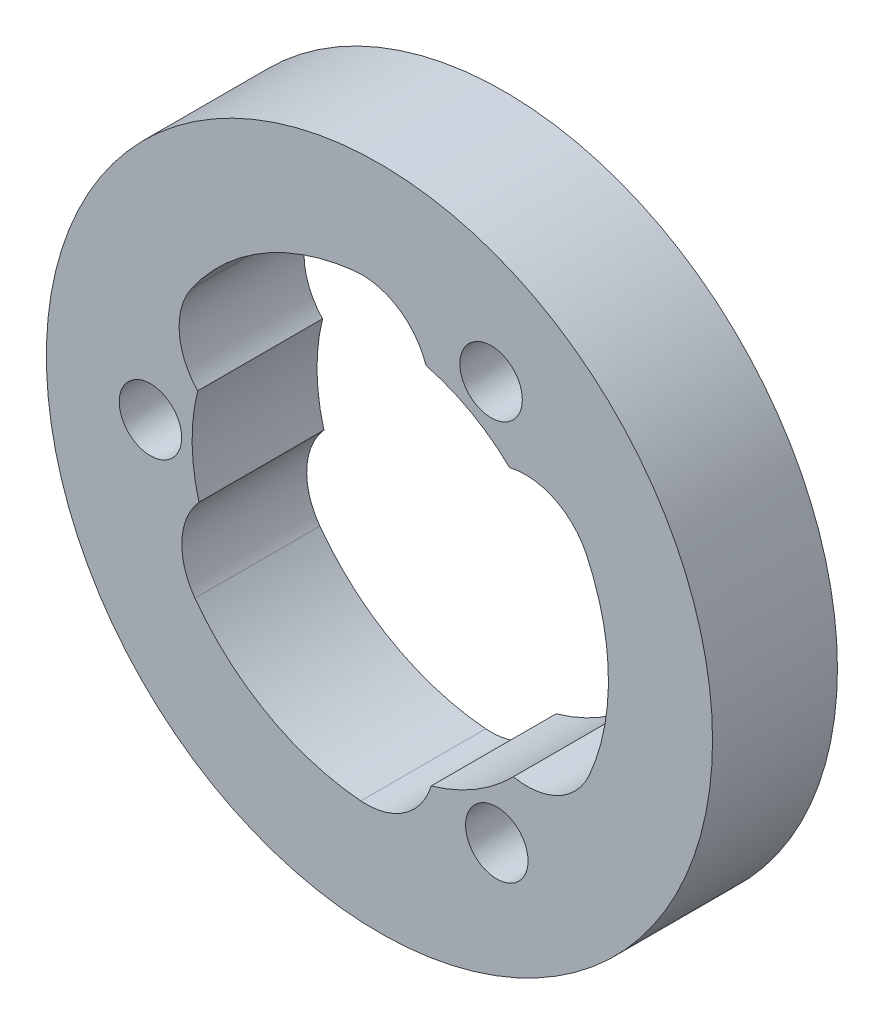
ISO-10303-21;
HEADER;
FILE_DESCRIPTION(('STEP AP214'),'2;1');
FILE_NAME('part.step','',(''),(''),'','','');
FILE_SCHEMA(('AUTOMOTIVE_DESIGN { 1 0 10303 214 1 1 1 1 }'));
ENDSEC;
DATA;
#1=APPLICATION_CONTEXT('core data for automotive mechanical design processes');
#2=APPLICATION_PROTOCOL_DEFINITION('international standard','automotive_design',2000,#1);
#3=PRODUCT_CONTEXT('',#1,'mechanical');
#4=PRODUCT('Part','Part','',(#3));
#5=PRODUCT_RELATED_PRODUCT_CATEGORY('part','',(#4));
#6=PRODUCT_DEFINITION_FORMATION('','',#4);
#7=PRODUCT_DEFINITION_CONTEXT('part definition',#1,'design');
#8=PRODUCT_DEFINITION('design','',#6,#7);
#9=PRODUCT_DEFINITION_SHAPE('','',#8);
#10=(LENGTH_UNIT() NAMED_UNIT(*) SI_UNIT(.MILLI.,.METRE.));
#11=(NAMED_UNIT(*) PLANE_ANGLE_UNIT() SI_UNIT($,.RADIAN.));
#12=(NAMED_UNIT(*) SI_UNIT($,.STERADIAN.) SOLID_ANGLE_UNIT());
#13=UNCERTAINTY_MEASURE_WITH_UNIT(LENGTH_MEASURE(1.E-05),#10,'distance_accuracy_value','');
#14=(GEOMETRIC_REPRESENTATION_CONTEXT(3) GLOBAL_UNCERTAINTY_ASSIGNED_CONTEXT((#13)) GLOBAL_UNIT_ASSIGNED_CONTEXT((#10,
#11,#12)) REPRESENTATION_CONTEXT('',''));
#15=CARTESIAN_POINT('',(0.,0.,0.));
#16=DIRECTION('',(0.,0.,1.));
#17=DIRECTION('',(1.,0.,0.));
#18=AXIS2_PLACEMENT_3D('',#15,#16,#17);
#19=CARTESIAN_POINT('',(0.,0.,6.));
#20=DIRECTION('',(0.,0.,1.));
#21=DIRECTION('',(1.,0.,0.));
#22=AXIS2_PLACEMENT_3D('',#19,#20,#21);
#23=PLANE('',#22);
#24=CARTESIAN_POINT('',(5.36232428206179,9.60445096265309,6.));
#25=DIRECTION('',(0.,0.,1.));
#26=DIRECTION('',(1.,0.,0.));
#27=AXIS2_PLACEMENT_3D('',#24,#25,#26);
#28=CIRCLE('',#27,1.50000000000234);
#29=CARTESIAN_POINT('',(6.86232428206413,9.60445096265309,6.));
#30=VERTEX_POINT('',#29);
#31=EDGE_CURVE('E167',#30,#30,#28,.T.);
#32=ORIENTED_EDGE('',*,*,#31,.F.);
#33=EDGE_LOOP('',(#32));
#34=FACE_BOUND('',#33,.T.);
#35=CARTESIAN_POINT('',(0.,0.,6.));
#36=DIRECTION('',(0.,0.,1.));
#37=DIRECTION('',(1.,0.,0.));
#38=AXIS2_PLACEMENT_3D('',#35,#36,#37);
#39=CIRCLE('',#38,16.);
#40=CARTESIAN_POINT('',(16.,0.,6.));
#41=VERTEX_POINT('',#40);
#42=EDGE_CURVE('E11',#41,#41,#39,.T.);
#43=ORIENTED_EDGE('',*,*,#42,.T.);
#44=EDGE_LOOP('',(#43));
#45=FACE_BOUND('',#44,.T.);
#46=CARTESIAN_POINT('',(-10.9988606640904,-0.158316429730885,6.));
#47=DIRECTION('',(0.,0.,1.));
#48=DIRECTION('',(1.,0.,0.));
#49=AXIS2_PLACEMENT_3D('',#46,#47,#48);
#50=CIRCLE('',#49,1.50000000000233);
#51=CARTESIAN_POINT('',(-9.49886066408805,-0.158316429730885,6.));
#52=VERTEX_POINT('',#51);
#53=EDGE_CURVE('E217',#52,#52,#50,.T.);
#54=ORIENTED_EDGE('',*,*,#53,.F.);
#55=EDGE_LOOP('',(#54));
#56=FACE_BOUND('',#55,.T.);
#57=CARTESIAN_POINT('',(7.0975423071489,-3.11245774240257,6.));
#58=DIRECTION('',(0.,0.,1.));
#59=DIRECTION('',(1.,0.,0.));
#60=AXIS2_PLACEMENT_3D('',#57,#58,#59);
#61=CIRCLE('',#60,3.24999999999912);
#62=CARTESIAN_POINT('',(6.43330341520316,-6.29385471455504,6.));
#63=VERTEX_POINT('',#62);
#64=CARTESIAN_POINT('',(10.0739310165974,-4.41768195695802,6.));
#65=VERTEX_POINT('',#64);
#66=EDGE_CURVE('E129',#63,#65,#61,.T.);
#67=ORIENTED_EDGE('',*,*,#66,.F.);
#68=CARTESIAN_POINT('',(0.,0.,6.));
#69=DIRECTION('',(0.,0.,1.));
#70=DIRECTION('',(1.,0.,0.));
#71=AXIS2_PLACEMENT_3D('',#68,#69,#70);
#72=CIRCLE('',#71,9.);
#73=CARTESIAN_POINT('',(2.48399034547778,-8.65042149051563,6.));
#74=VERTEX_POINT('',#73);
#75=EDGE_CURVE('E121',#74,#63,#72,.T.);
#76=ORIENTED_EDGE('',*,*,#75,.F.);
#77=CARTESIAN_POINT('',(-0.6312472118548,-7.72424928116174,6.));
#78=DIRECTION('',(0.,0.,1.));
#79=DIRECTION('',(1.,0.,0.));
#80=AXIS2_PLACEMENT_3D('',#77,#78,#79);
#81=CIRCLE('',#80,3.24999999999922);
#82=CARTESIAN_POINT('',(-0.895963784568041,-10.9634505926158,6.));
#83=VERTEX_POINT('',#82);
#84=EDGE_CURVE('E164',#83,#74,#81,.T.);
#85=ORIENTED_EDGE('',*,*,#84,.F.);
#86=CARTESIAN_POINT('',(0.,0.,6.));
#87=DIRECTION('',(0.,0.,1.));
#88=DIRECTION('',(1.,0.,0.));
#89=AXIS2_PLACEMENT_3D('',#86,#87,#88);
#90=CIRCLE('',#89,10.9999999999992);
#91=CARTESIAN_POINT('',(-8.86279030886448,-6.51543919786632,6.));
#92=VERTEX_POINT('',#91);
#93=EDGE_CURVE('E162',#92,#83,#90,.T.);
#94=ORIENTED_EDGE('',*,*,#93,.F.);
#95=CARTESIAN_POINT('',(-6.24423862670063,-4.59042307122448,6.));
#96=DIRECTION('',(0.,0.,1.));
#97=DIRECTION('',(1.,0.,0.));
#98=AXIS2_PLACEMENT_3D('',#95,#96,#97);
#99=CIRCLE('',#98,3.24999999999912);
#100=CARTESIAN_POINT('',(-8.66728977813536,-2.42447683054102,6.));
#101=VERTEX_POINT('',#100);
#102=EDGE_CURVE('E160',#101,#92,#99,.T.);
#103=ORIENTED_EDGE('',*,*,#102,.F.);
#104=CARTESIAN_POINT('',(0.,0.,6.));
#105=DIRECTION('',(0.,0.,1.));
#106=DIRECTION('',(1.,0.,0.));
#107=AXIS2_PLACEMENT_3D('',#104,#105,#106);
#108=CIRCLE('',#107,9.);
#109=CARTESIAN_POINT('',(-8.73347993696803,2.17401200331875,6.));
#110=VERTEX_POINT('',#109);
#111=EDGE_CURVE('E158',#110,#101,#108,.T.);
#112=ORIENTED_EDGE('',*,*,#111,.F.);
#113=CARTESIAN_POINT('',(-6.37377249672235,4.40880076211522,6.));
#114=DIRECTION('',(0.,0.,1.));
#115=DIRECTION('',(1.,0.,0.));
#116=AXIS2_PLACEMENT_3D('',#113,#114,#115);
#117=CIRCLE('',#116,3.24999999999906);
#118=CARTESIAN_POINT('',(-9.04664483405625,6.25765269461415,6.));
#119=VERTEX_POINT('',#118);
#120=EDGE_CURVE('E156',#119,#110,#117,.T.);
#121=ORIENTED_EDGE('',*,*,#120,.F.);
#122=CARTESIAN_POINT('',(0.,0.,6.));
#123=DIRECTION('',(0.,0.,1.));
#124=DIRECTION('',(1.,0.,0.));
#125=AXIS2_PLACEMENT_3D('',#122,#123,#124);
#126=CIRCLE('',#125,10.9999999999986);
#127=CARTESIAN_POINT('',(-1.21114070773317,10.933121154824,6.));
#128=VERTEX_POINT('',#127);
#129=EDGE_CURVE('E154',#128,#119,#126,.T.);
#130=ORIENTED_EDGE('',*,*,#129,.F.);
#131=CARTESIAN_POINT('',(-0.853303680448273,7.70288081362704,6.));
#132=DIRECTION('',(0.,0.,1.));
#133=DIRECTION('',(1.,0.,0.));
#134=AXIS2_PLACEMENT_3D('',#131,#132,#133);
#135=CIRCLE('',#134,3.2499999999988);
#136=CARTESIAN_POINT('',(2.23398636293237,8.71833154509693,6.));
#137=VERTEX_POINT('',#136);
#138=EDGE_CURVE('E152',#137,#128,#135,.T.);
#139=ORIENTED_EDGE('',*,*,#138,.F.);
#140=CARTESIAN_POINT('',(0.,0.,6.));
#141=DIRECTION('',(0.,0.,1.));
#142=DIRECTION('',(1.,0.,0.));
#143=AXIS2_PLACEMENT_3D('',#140,#141,#142);
#144=CIRCLE('',#143,9.);
#145=CARTESIAN_POINT('',(6.24948959149049,6.47640948719686,6.));
#146=VERTEX_POINT('',#145);
#147=EDGE_CURVE('E150',#146,#137,#144,.T.);
#148=ORIENTED_EDGE('',*,*,#147,.F.);
#149=CARTESIAN_POINT('',(7.00501970857715,3.31544851904651,6.));
#150=DIRECTION('',(0.,0.,1.));
#151=DIRECTION('',(1.,0.,0.));
#152=AXIS2_PLACEMENT_3D('',#149,#150,#151);
#153=CIRCLE('',#152,3.24999999999922);
#154=CARTESIAN_POINT('',(9.94260861862474,4.70579789800108,6.));
#155=VERTEX_POINT('',#154);
#156=EDGE_CURVE('E145',#155,#146,#153,.T.);
#157=ORIENTED_EDGE('',*,*,#156,.F.);
#158=CARTESIAN_POINT('',(0.,0.,6.));
#159=DIRECTION('',(0.,0.,1.));
#160=DIRECTION('',(1.,0.,0.));
#161=AXIS2_PLACEMENT_3D('',#158,#159,#160);
#162=CIRCLE('',#161,10.9999999999992);
#163=EDGE_CURVE('E143',#65,#155,#162,.T.);
#164=ORIENTED_EDGE('',*,*,#163,.F.);
#165=EDGE_LOOP('',(#67,#76,#85,#94,#103,#112,#121,#130,#139,#148,#157,#164));
#166=FACE_BOUND('',#165,.T.);
#167=CARTESIAN_POINT('',(5.6365363820286,-9.44613453292221,6.));
#168=DIRECTION('',(0.,0.,1.));
#169=DIRECTION('',(1.,0.,0.));
#170=AXIS2_PLACEMENT_3D('',#167,#168,#169);
#171=CIRCLE('',#170,1.50000000000236);
#172=CARTESIAN_POINT('',(7.13653638203096,-9.44613453292221,6.));
#173=VERTEX_POINT('',#172);
#174=EDGE_CURVE('E261',#173,#173,#171,.T.);
#175=ORIENTED_EDGE('',*,*,#174,.F.);
#176=EDGE_LOOP('',(#175));
#177=FACE_BOUND('',#176,.T.);
#178=ADVANCED_FACE('F32',(#34,#45,#56,#166,#177),#23,.T.);
#179=CARTESIAN_POINT('',(0.,0.,0.));
#180=DIRECTION('',(0.,0.,1.));
#181=DIRECTION('',(1.,0.,0.));
#182=AXIS2_PLACEMENT_3D('',#179,#180,#181);
#183=PLANE('',#182);
#184=CARTESIAN_POINT('',(-10.9988606640904,-0.158316429730885,0.));
#185=DIRECTION('',(0.,0.,1.));
#186=DIRECTION('',(1.,0.,0.));
#187=AXIS2_PLACEMENT_3D('',#184,#185,#186);
#188=CIRCLE('',#187,1.50000000000233);
#189=CARTESIAN_POINT('',(-9.49886066408805,-0.158316429730885,0.));
#190=VERTEX_POINT('',#189);
#191=EDGE_CURVE('E137',#190,#190,#188,.T.);
#192=ORIENTED_EDGE('',*,*,#191,.T.);
#193=EDGE_LOOP('',(#192));
#194=FACE_BOUND('',#193,.T.);
#195=CARTESIAN_POINT('',(0.,0.,0.));
#196=DIRECTION('',(0.,0.,1.));
#197=DIRECTION('',(1.,0.,0.));
#198=AXIS2_PLACEMENT_3D('',#195,#196,#197);
#199=CIRCLE('',#198,16.);
#200=CARTESIAN_POINT('',(16.,0.,0.));
#201=VERTEX_POINT('',#200);
#202=EDGE_CURVE('E36',#201,#201,#199,.T.);
#203=ORIENTED_EDGE('',*,*,#202,.F.);
#204=EDGE_LOOP('',(#203));
#205=FACE_BOUND('',#204,.T.);
#206=CARTESIAN_POINT('',(0.,0.,0.));
#207=DIRECTION('',(0.,0.,1.));
#208=DIRECTION('',(1.,0.,0.));
#209=AXIS2_PLACEMENT_3D('',#206,#207,#208);
#210=CIRCLE('',#209,9.);
#211=CARTESIAN_POINT('',(2.48399034547778,-8.65042149051563,0.));
#212=VERTEX_POINT('',#211);
#213=CARTESIAN_POINT('',(6.43330341520316,-6.29385471455504,0.));
#214=VERTEX_POINT('',#213);
#215=EDGE_CURVE('E55',#212,#214,#210,.T.);
#216=ORIENTED_EDGE('',*,*,#215,.T.);
#217=CARTESIAN_POINT('',(7.0975423071489,-3.11245774240257,0.));
#218=DIRECTION('',(0.,0.,1.));
#219=DIRECTION('',(1.,0.,0.));
#220=AXIS2_PLACEMENT_3D('',#217,#218,#219);
#221=CIRCLE('',#220,3.24999999999912);
#222=CARTESIAN_POINT('',(10.0739310165974,-4.41768195695802,0.));
#223=VERTEX_POINT('',#222);
#224=EDGE_CURVE('E136',#214,#223,#221,.T.);
#225=ORIENTED_EDGE('',*,*,#224,.T.);
#226=CARTESIAN_POINT('',(0.,0.,0.));
#227=DIRECTION('',(0.,0.,1.));
#228=DIRECTION('',(1.,0.,0.));
#229=AXIS2_PLACEMENT_3D('',#226,#227,#228);
#230=CIRCLE('',#229,10.9999999999992);
#231=CARTESIAN_POINT('',(9.94260861862474,4.70579789800108,0.));
#232=VERTEX_POINT('',#231);
#233=EDGE_CURVE('E169',#223,#232,#230,.T.);
#234=ORIENTED_EDGE('',*,*,#233,.T.);
#235=CARTESIAN_POINT('',(7.00501970857715,3.31544851904651,0.));
#236=DIRECTION('',(0.,0.,1.));
#237=DIRECTION('',(1.,0.,0.));
#238=AXIS2_PLACEMENT_3D('',#235,#236,#237);
#239=CIRCLE('',#238,3.24999999999922);
#240=CARTESIAN_POINT('',(6.24948959149049,6.47640948719686,0.));
#241=VERTEX_POINT('',#240);
#242=EDGE_CURVE('E172',#232,#241,#239,.T.);
#243=ORIENTED_EDGE('',*,*,#242,.T.);
#244=CARTESIAN_POINT('',(0.,0.,0.));
#245=DIRECTION('',(0.,0.,1.));
#246=DIRECTION('',(1.,0.,0.));
#247=AXIS2_PLACEMENT_3D('',#244,#245,#246);
#248=CIRCLE('',#247,9.);
#249=CARTESIAN_POINT('',(2.23398636293237,8.71833154509693,0.));
#250=VERTEX_POINT('',#249);
#251=EDGE_CURVE('E175',#241,#250,#248,.T.);
#252=ORIENTED_EDGE('',*,*,#251,.T.);
#253=CARTESIAN_POINT('',(-0.853303680448273,7.70288081362704,0.));
#254=DIRECTION('',(0.,0.,1.));
#255=DIRECTION('',(1.,0.,0.));
#256=AXIS2_PLACEMENT_3D('',#253,#254,#255);
#257=CIRCLE('',#256,3.2499999999988);
#258=CARTESIAN_POINT('',(-1.21114070773317,10.933121154824,0.));
#259=VERTEX_POINT('',#258);
#260=EDGE_CURVE('E178',#250,#259,#257,.T.);
#261=ORIENTED_EDGE('',*,*,#260,.T.);
#262=CARTESIAN_POINT('',(0.,0.,0.));
#263=DIRECTION('',(0.,0.,1.));
#264=DIRECTION('',(1.,0.,0.));
#265=AXIS2_PLACEMENT_3D('',#262,#263,#264);
#266=CIRCLE('',#265,10.9999999999986);
#267=CARTESIAN_POINT('',(-9.04664483405625,6.25765269461415,0.));
#268=VERTEX_POINT('',#267);
#269=EDGE_CURVE('E181',#259,#268,#266,.T.);
#270=ORIENTED_EDGE('',*,*,#269,.T.);
#271=CARTESIAN_POINT('',(-6.37377249672235,4.40880076211522,0.));
#272=DIRECTION('',(0.,0.,1.));
#273=DIRECTION('',(1.,0.,0.));
#274=AXIS2_PLACEMENT_3D('',#271,#272,#273);
#275=CIRCLE('',#274,3.24999999999906);
#276=CARTESIAN_POINT('',(-8.73347993696803,2.17401200331875,0.));
#277=VERTEX_POINT('',#276);
#278=EDGE_CURVE('E184',#268,#277,#275,.T.);
#279=ORIENTED_EDGE('',*,*,#278,.T.);
#280=CARTESIAN_POINT('',(0.,0.,0.));
#281=DIRECTION('',(0.,0.,1.));
#282=DIRECTION('',(1.,0.,0.));
#283=AXIS2_PLACEMENT_3D('',#280,#281,#282);
#284=CIRCLE('',#283,9.);
#285=CARTESIAN_POINT('',(-8.66728977813536,-2.42447683054102,0.));
#286=VERTEX_POINT('',#285);
#287=EDGE_CURVE('E187',#277,#286,#284,.T.);
#288=ORIENTED_EDGE('',*,*,#287,.T.);
#289=CARTESIAN_POINT('',(-6.24423862670063,-4.59042307122448,0.));
#290=DIRECTION('',(0.,0.,1.));
#291=DIRECTION('',(1.,0.,0.));
#292=AXIS2_PLACEMENT_3D('',#289,#290,#291);
#293=CIRCLE('',#292,3.24999999999912);
#294=CARTESIAN_POINT('',(-8.86279030886448,-6.51543919786632,0.));
#295=VERTEX_POINT('',#294);
#296=EDGE_CURVE('E190',#286,#295,#293,.T.);
#297=ORIENTED_EDGE('',*,*,#296,.T.);
#298=CARTESIAN_POINT('',(0.,0.,0.));
#299=DIRECTION('',(0.,0.,1.));
#300=DIRECTION('',(1.,0.,0.));
#301=AXIS2_PLACEMENT_3D('',#298,#299,#300);
#302=CIRCLE('',#301,10.9999999999992);
#303=CARTESIAN_POINT('',(-0.895963784568028,-10.9634505926157,0.));
#304=VERTEX_POINT('',#303);
#305=EDGE_CURVE('E193',#295,#304,#302,.T.);
#306=ORIENTED_EDGE('',*,*,#305,.T.);
#307=CARTESIAN_POINT('',(-0.6312472118548,-7.72424928116174,0.));
#308=DIRECTION('',(0.,0.,1.));
#309=DIRECTION('',(1.,0.,0.));
#310=AXIS2_PLACEMENT_3D('',#307,#308,#309);
#311=CIRCLE('',#310,3.24999999999922);
#312=EDGE_CURVE('E130',#304,#212,#311,.T.);
#313=ORIENTED_EDGE('',*,*,#312,.T.);
#314=EDGE_LOOP('',(#216,#225,#234,#243,#252,#261,#270,#279,#288,#297,#306,#313));
#315=FACE_BOUND('',#314,.T.);
#316=CARTESIAN_POINT('',(5.36232428206179,9.60445096265309,0.));
#317=DIRECTION('',(0.,0.,1.));
#318=DIRECTION('',(1.,0.,0.));
#319=AXIS2_PLACEMENT_3D('',#316,#317,#318);
#320=CIRCLE('',#319,1.50000000000234);
#321=CARTESIAN_POINT('',(6.86232428206413,9.60445096265309,0.));
#322=VERTEX_POINT('',#321);
#323=EDGE_CURVE('E256',#322,#322,#320,.T.);
#324=ORIENTED_EDGE('',*,*,#323,.T.);
#325=EDGE_LOOP('',(#324));
#326=FACE_BOUND('',#325,.T.);
#327=CARTESIAN_POINT('',(5.6365363820286,-9.44613453292221,0.));
#328=DIRECTION('',(0.,0.,1.));
#329=DIRECTION('',(1.,0.,0.));
#330=AXIS2_PLACEMENT_3D('',#327,#328,#329);
#331=CIRCLE('',#330,1.50000000000236);
#332=CARTESIAN_POINT('',(7.13653638203096,-9.44613453292221,0.));
#333=VERTEX_POINT('',#332);
#334=EDGE_CURVE('E259',#333,#333,#331,.T.);
#335=ORIENTED_EDGE('',*,*,#334,.T.);
#336=EDGE_LOOP('',(#335));
#337=FACE_BOUND('',#336,.T.);
#338=ADVANCED_FACE('F223',(#194,#205,#315,#326,#337),#183,.F.);
#339=CARTESIAN_POINT('',(0.,0.,6.));
#340=DIRECTION('',(0.,0.,-1.));
#341=DIRECTION('',(-1.,0.,0.));
#342=AXIS2_PLACEMENT_3D('',#339,#340,#341);
#343=CYLINDRICAL_SURFACE('',#342,16.);
#344=ORIENTED_EDGE('',*,*,#42,.F.);
#345=EDGE_LOOP('',(#344));
#346=FACE_BOUND('',#345,.T.);
#347=ORIENTED_EDGE('',*,*,#202,.T.);
#348=EDGE_LOOP('',(#347));
#349=FACE_BOUND('',#348,.T.);
#350=ADVANCED_FACE('F34',(#346,#349),#343,.T.);
#351=CARTESIAN_POINT('',(-10.9988606640904,-0.158316429730885,6.));
#352=DIRECTION('',(0.,0.,-1.));
#353=DIRECTION('',(-1.,0.,0.));
#354=AXIS2_PLACEMENT_3D('',#351,#352,#353);
#355=CYLINDRICAL_SURFACE('',#354,1.50000000000233);
#356=ORIENTED_EDGE('',*,*,#53,.T.);
#357=EDGE_LOOP('',(#356));
#358=FACE_BOUND('',#357,.T.);
#359=ORIENTED_EDGE('',*,*,#191,.F.);
#360=EDGE_LOOP('',(#359));
#361=FACE_BOUND('',#360,.T.);
#362=ADVANCED_FACE('F226',(#358,#361),#355,.F.);
#363=CARTESIAN_POINT('',(0.,0.,6.));
#364=DIRECTION('',(0.,0.,-1.));
#365=DIRECTION('',(-1.,0.,0.));
#366=AXIS2_PLACEMENT_3D('',#363,#364,#365);
#367=CYLINDRICAL_SURFACE('',#366,9.);
#368=ORIENTED_EDGE('',*,*,#215,.F.);
#369=DIRECTION('',(0.,0.,-1.));
#370=VECTOR('',#369,1.);
#371=CARTESIAN_POINT('',(2.48399034547778,-8.65042149051563,6.));
#372=LINE('',#371,#370);
#373=EDGE_CURVE('E125',#74,#212,#372,.T.);
#374=ORIENTED_EDGE('',*,*,#373,.F.);
#375=ORIENTED_EDGE('',*,*,#75,.T.);
#376=DIRECTION('',(0.,0.,-1.));
#377=VECTOR('',#376,1.);
#378=CARTESIAN_POINT('',(6.43330341520316,-6.29385471455504,6.));
#379=LINE('',#378,#377);
#380=EDGE_CURVE('E124',#63,#214,#379,.T.);
#381=ORIENTED_EDGE('',*,*,#380,.T.);
#382=EDGE_LOOP('',(#368,#374,#375,#381));
#383=FACE_BOUND('',#382,.T.);
#384=ADVANCED_FACE('F123',(#383),#367,.F.);
#385=CARTESIAN_POINT('',(7.0975423071489,-3.11245774240257,6.));
#386=DIRECTION('',(0.,0.,-1.));
#387=DIRECTION('',(-1.,0.,0.));
#388=AXIS2_PLACEMENT_3D('',#385,#386,#387);
#389=CYLINDRICAL_SURFACE('',#388,3.24999999999912);
#390=ORIENTED_EDGE('',*,*,#224,.F.);
#391=ORIENTED_EDGE('',*,*,#380,.F.);
#392=ORIENTED_EDGE('',*,*,#66,.T.);
#393=DIRECTION('',(0.,0.,-1.));
#394=VECTOR('',#393,1.);
#395=CARTESIAN_POINT('',(10.0739310165974,-4.41768195695802,6.));
#396=LINE('',#395,#394);
#397=EDGE_CURVE('E138',#65,#223,#396,.T.);
#398=ORIENTED_EDGE('',*,*,#397,.T.);
#399=EDGE_LOOP('',(#390,#391,#392,#398));
#400=FACE_BOUND('',#399,.T.);
#401=ADVANCED_FACE('F133',(#400),#389,.F.);
#402=CARTESIAN_POINT('',(0.,0.,6.));
#403=DIRECTION('',(0.,0.,-1.));
#404=DIRECTION('',(-1.,0.,0.));
#405=AXIS2_PLACEMENT_3D('',#402,#403,#404);
#406=CYLINDRICAL_SURFACE('',#405,10.9999999999992);
#407=ORIENTED_EDGE('',*,*,#233,.F.);
#408=ORIENTED_EDGE('',*,*,#397,.F.);
#409=ORIENTED_EDGE('',*,*,#163,.T.);
#410=DIRECTION('',(0.,0.,-1.));
#411=VECTOR('',#410,1.);
#412=CARTESIAN_POINT('',(9.94260861862474,4.70579789800108,6.));
#413=LINE('',#412,#411);
#414=EDGE_CURVE('E214',#155,#232,#413,.T.);
#415=ORIENTED_EDGE('',*,*,#414,.T.);
#416=EDGE_LOOP('',(#407,#408,#409,#415));
#417=FACE_BOUND('',#416,.T.);
#418=ADVANCED_FACE('F312',(#417),#406,.F.);
#419=CARTESIAN_POINT('',(7.00501970857715,3.31544851904651,6.));
#420=DIRECTION('',(0.,0.,-1.));
#421=DIRECTION('',(-1.,0.,0.));
#422=AXIS2_PLACEMENT_3D('',#419,#420,#421);
#423=CYLINDRICAL_SURFACE('',#422,3.24999999999922);
#424=ORIENTED_EDGE('',*,*,#242,.F.);
#425=ORIENTED_EDGE('',*,*,#414,.F.);
#426=ORIENTED_EDGE('',*,*,#156,.T.);
#427=DIRECTION('',(0.,0.,-1.));
#428=VECTOR('',#427,1.);
#429=CARTESIAN_POINT('',(6.24948959149049,6.47640948719686,6.));
#430=LINE('',#429,#428);
#431=EDGE_CURVE('E212',#146,#241,#430,.T.);
#432=ORIENTED_EDGE('',*,*,#431,.T.);
#433=EDGE_LOOP('',(#424,#425,#426,#432));
#434=FACE_BOUND('',#433,.T.);
#435=ADVANCED_FACE('F308',(#434),#423,.F.);
#436=CARTESIAN_POINT('',(0.,0.,6.));
#437=DIRECTION('',(0.,0.,-1.));
#438=DIRECTION('',(-1.,0.,0.));
#439=AXIS2_PLACEMENT_3D('',#436,#437,#438);
#440=CYLINDRICAL_SURFACE('',#439,9.);
#441=ORIENTED_EDGE('',*,*,#251,.F.);
#442=ORIENTED_EDGE('',*,*,#431,.F.);
#443=ORIENTED_EDGE('',*,*,#147,.T.);
#444=DIRECTION('',(0.,0.,-1.));
#445=VECTOR('',#444,1.);
#446=CARTESIAN_POINT('',(2.23398636293237,8.71833154509693,6.));
#447=LINE('',#446,#445);
#448=EDGE_CURVE('E210',#137,#250,#447,.T.);
#449=ORIENTED_EDGE('',*,*,#448,.T.);
#450=EDGE_LOOP('',(#441,#442,#443,#449));
#451=FACE_BOUND('',#450,.T.);
#452=ADVANCED_FACE('F304',(#451),#440,.F.);
#453=CARTESIAN_POINT('',(-0.853303680448273,7.70288081362704,6.));
#454=DIRECTION('',(0.,0.,-1.));
#455=DIRECTION('',(-1.,0.,0.));
#456=AXIS2_PLACEMENT_3D('',#453,#454,#455);
#457=CYLINDRICAL_SURFACE('',#456,3.2499999999988);
#458=ORIENTED_EDGE('',*,*,#260,.F.);
#459=ORIENTED_EDGE('',*,*,#448,.F.);
#460=ORIENTED_EDGE('',*,*,#138,.T.);
#461=DIRECTION('',(0.,0.,-1.));
#462=VECTOR('',#461,1.);
#463=CARTESIAN_POINT('',(-1.21114070773317,10.933121154824,6.));
#464=LINE('',#463,#462);
#465=EDGE_CURVE('E208',#128,#259,#464,.T.);
#466=ORIENTED_EDGE('',*,*,#465,.T.);
#467=EDGE_LOOP('',(#458,#459,#460,#466));
#468=FACE_BOUND('',#467,.T.);
#469=ADVANCED_FACE('F300',(#468),#457,.F.);
#470=CARTESIAN_POINT('',(0.,0.,6.));
#471=DIRECTION('',(0.,0.,-1.));
#472=DIRECTION('',(-1.,0.,0.));
#473=AXIS2_PLACEMENT_3D('',#470,#471,#472);
#474=CYLINDRICAL_SURFACE('',#473,10.9999999999986);
#475=ORIENTED_EDGE('',*,*,#269,.F.);
#476=ORIENTED_EDGE('',*,*,#465,.F.);
#477=ORIENTED_EDGE('',*,*,#129,.T.);
#478=DIRECTION('',(0.,0.,-1.));
#479=VECTOR('',#478,1.);
#480=CARTESIAN_POINT('',(-9.04664483405625,6.25765269461415,6.));
#481=LINE('',#480,#479);
#482=EDGE_CURVE('E206',#119,#268,#481,.T.);
#483=ORIENTED_EDGE('',*,*,#482,.T.);
#484=EDGE_LOOP('',(#475,#476,#477,#483));
#485=FACE_BOUND('',#484,.T.);
#486=ADVANCED_FACE('F296',(#485),#474,.F.);
#487=CARTESIAN_POINT('',(-6.37377249672235,4.40880076211522,6.));
#488=DIRECTION('',(0.,0.,-1.));
#489=DIRECTION('',(-1.,0.,0.));
#490=AXIS2_PLACEMENT_3D('',#487,#488,#489);
#491=CYLINDRICAL_SURFACE('',#490,3.24999999999906);
#492=ORIENTED_EDGE('',*,*,#278,.F.);
#493=ORIENTED_EDGE('',*,*,#482,.F.);
#494=ORIENTED_EDGE('',*,*,#120,.T.);
#495=DIRECTION('',(0.,0.,-1.));
#496=VECTOR('',#495,1.);
#497=CARTESIAN_POINT('',(-8.73347993696803,2.17401200331875,6.));
#498=LINE('',#497,#496);
#499=EDGE_CURVE('E204',#110,#277,#498,.T.);
#500=ORIENTED_EDGE('',*,*,#499,.T.);
#501=EDGE_LOOP('',(#492,#493,#494,#500));
#502=FACE_BOUND('',#501,.T.);
#503=ADVANCED_FACE('F292',(#502),#491,.F.);
#504=CARTESIAN_POINT('',(0.,0.,6.));
#505=DIRECTION('',(0.,0.,-1.));
#506=DIRECTION('',(-1.,0.,0.));
#507=AXIS2_PLACEMENT_3D('',#504,#505,#506);
#508=CYLINDRICAL_SURFACE('',#507,9.);
#509=ORIENTED_EDGE('',*,*,#287,.F.);
#510=ORIENTED_EDGE('',*,*,#499,.F.);
#511=ORIENTED_EDGE('',*,*,#111,.T.);
#512=DIRECTION('',(0.,0.,-1.));
#513=VECTOR('',#512,1.);
#514=CARTESIAN_POINT('',(-8.66728977813536,-2.42447683054102,6.));
#515=LINE('',#514,#513);
#516=EDGE_CURVE('E202',#101,#286,#515,.T.);
#517=ORIENTED_EDGE('',*,*,#516,.T.);
#518=EDGE_LOOP('',(#509,#510,#511,#517));
#519=FACE_BOUND('',#518,.T.);
#520=ADVANCED_FACE('F288',(#519),#508,.F.);
#521=CARTESIAN_POINT('',(-6.24423862670063,-4.59042307122448,6.));
#522=DIRECTION('',(0.,0.,-1.));
#523=DIRECTION('',(-1.,0.,0.));
#524=AXIS2_PLACEMENT_3D('',#521,#522,#523);
#525=CYLINDRICAL_SURFACE('',#524,3.24999999999912);
#526=ORIENTED_EDGE('',*,*,#296,.F.);
#527=ORIENTED_EDGE('',*,*,#516,.F.);
#528=ORIENTED_EDGE('',*,*,#102,.T.);
#529=DIRECTION('',(0.,0.,-1.));
#530=VECTOR('',#529,1.);
#531=CARTESIAN_POINT('',(-8.86279030886448,-6.51543919786632,6.));
#532=LINE('',#531,#530);
#533=EDGE_CURVE('E200',#92,#295,#532,.T.);
#534=ORIENTED_EDGE('',*,*,#533,.T.);
#535=EDGE_LOOP('',(#526,#527,#528,#534));
#536=FACE_BOUND('',#535,.T.);
#537=ADVANCED_FACE('F284',(#536),#525,.F.);
#538=CARTESIAN_POINT('',(0.,0.,6.));
#539=DIRECTION('',(0.,0.,-1.));
#540=DIRECTION('',(-1.,0.,0.));
#541=AXIS2_PLACEMENT_3D('',#538,#539,#540);
#542=CYLINDRICAL_SURFACE('',#541,10.9999999999992);
#543=ORIENTED_EDGE('',*,*,#305,.F.);
#544=ORIENTED_EDGE('',*,*,#533,.F.);
#545=ORIENTED_EDGE('',*,*,#93,.T.);
#546=DIRECTION('',(0.,0.,-1.));
#547=VECTOR('',#546,1.);
#548=CARTESIAN_POINT('',(-0.895963784568028,-10.9634505926157,6.));
#549=LINE('',#548,#547);
#550=EDGE_CURVE('E47',#83,#304,#549,.T.);
#551=ORIENTED_EDGE('',*,*,#550,.T.);
#552=EDGE_LOOP('',(#543,#544,#545,#551));
#553=FACE_BOUND('',#552,.T.);
#554=ADVANCED_FACE('F279',(#553),#542,.F.);
#555=CARTESIAN_POINT('',(-0.6312472118548,-7.72424928116174,6.));
#556=DIRECTION('',(0.,0.,-1.));
#557=DIRECTION('',(-1.,0.,0.));
#558=AXIS2_PLACEMENT_3D('',#555,#556,#557);
#559=CYLINDRICAL_SURFACE('',#558,3.24999999999922);
#560=ORIENTED_EDGE('',*,*,#312,.F.);
#561=ORIENTED_EDGE('',*,*,#550,.F.);
#562=ORIENTED_EDGE('',*,*,#84,.T.);
#563=ORIENTED_EDGE('',*,*,#373,.T.);
#564=EDGE_LOOP('',(#560,#561,#562,#563));
#565=FACE_BOUND('',#564,.T.);
#566=ADVANCED_FACE('F271',(#565),#559,.F.);
#567=CARTESIAN_POINT('',(5.36232428206179,9.60445096265309,6.));
#568=DIRECTION('',(0.,0.,-1.));
#569=DIRECTION('',(-1.,0.,0.));
#570=AXIS2_PLACEMENT_3D('',#567,#568,#569);
#571=CYLINDRICAL_SURFACE('',#570,1.50000000000234);
#572=ORIENTED_EDGE('',*,*,#31,.T.);
#573=EDGE_LOOP('',(#572));
#574=FACE_BOUND('',#573,.T.);
#575=ORIENTED_EDGE('',*,*,#323,.F.);
#576=EDGE_LOOP('',(#575));
#577=FACE_BOUND('',#576,.T.);
#578=ADVANCED_FACE('F267',(#574,#577),#571,.F.);
#579=CARTESIAN_POINT('',(5.6365363820286,-9.44613453292221,6.));
#580=DIRECTION('',(0.,0.,-1.));
#581=DIRECTION('',(-1.,0.,0.));
#582=AXIS2_PLACEMENT_3D('',#579,#580,#581);
#583=CYLINDRICAL_SURFACE('',#582,1.50000000000236);
#584=ORIENTED_EDGE('',*,*,#174,.T.);
#585=EDGE_LOOP('',(#584));
#586=FACE_BOUND('',#585,.T.);
#587=ORIENTED_EDGE('',*,*,#334,.F.);
#588=EDGE_LOOP('',(#587));
#589=FACE_BOUND('',#588,.T.);
#590=ADVANCED_FACE('F270',(#586,#589),#583,.F.);
#591=CLOSED_SHELL('',(#178,#338,#350,#362,#384,#401,#418,#435,#452,#469,#486,#503,#520,#537,
#554,#566,#578,#590));
#592=MANIFOLD_SOLID_BREP('B2',#591);
#593=ADVANCED_BREP_SHAPE_REPRESENTATION('',(#18,#592),#14);
#594=SHAPE_DEFINITION_REPRESENTATION(#9,#593);
ENDSEC;
END-ISO-10303-21;
